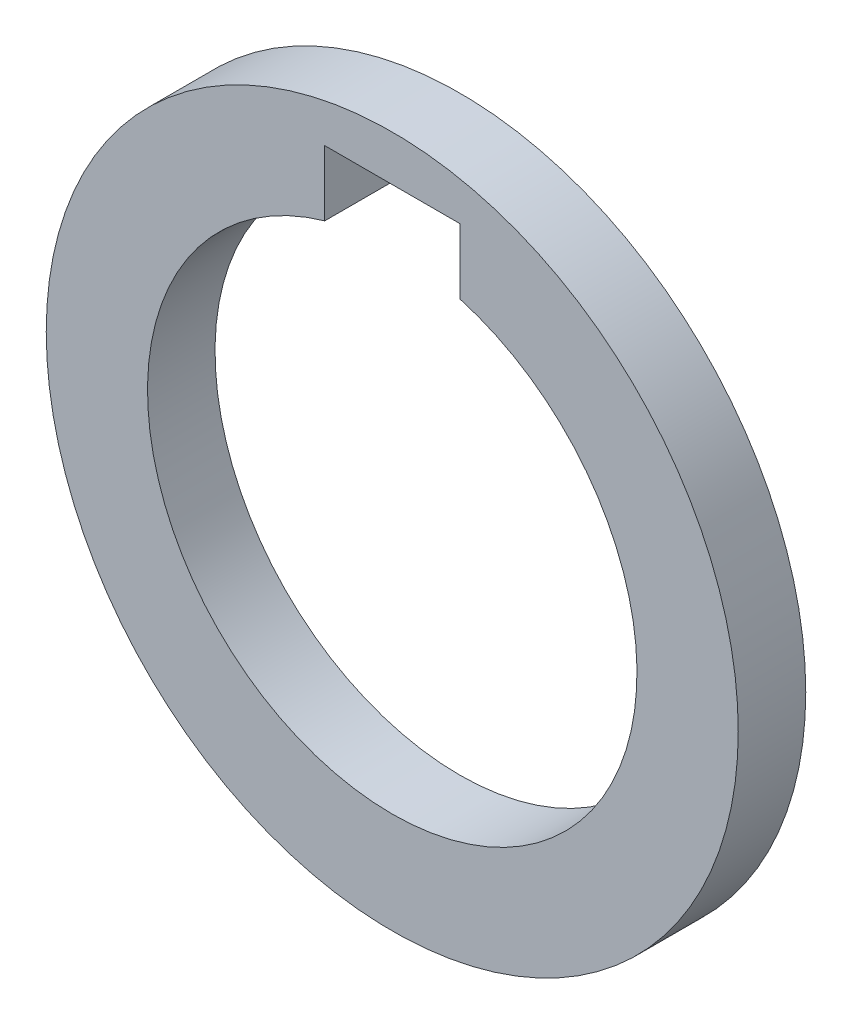
ISO-10303-21;
HEADER;
FILE_DESCRIPTION(('STEP AP214'),'2;1');
FILE_NAME('part.step','',(''),(''),'','','');
FILE_SCHEMA(('AUTOMOTIVE_DESIGN { 1 0 10303 214 1 1 1 1 }'));
ENDSEC;
DATA;
#1=APPLICATION_CONTEXT('core data for automotive mechanical design processes');
#2=APPLICATION_PROTOCOL_DEFINITION('international standard','automotive_design',2000,#1);
#3=PRODUCT_CONTEXT('',#1,'mechanical');
#4=PRODUCT('Part','Part','',(#3));
#5=PRODUCT_RELATED_PRODUCT_CATEGORY('part','',(#4));
#6=PRODUCT_DEFINITION_FORMATION('','',#4);
#7=PRODUCT_DEFINITION_CONTEXT('part definition',#1,'design');
#8=PRODUCT_DEFINITION('design','',#6,#7);
#9=PRODUCT_DEFINITION_SHAPE('','',#8);
#10=(LENGTH_UNIT() NAMED_UNIT(*) SI_UNIT(.MILLI.,.METRE.));
#11=(NAMED_UNIT(*) PLANE_ANGLE_UNIT() SI_UNIT($,.RADIAN.));
#12=(NAMED_UNIT(*) SI_UNIT($,.STERADIAN.) SOLID_ANGLE_UNIT());
#13=UNCERTAINTY_MEASURE_WITH_UNIT(LENGTH_MEASURE(1.E-05),#10,'distance_accuracy_value','');
#14=(GEOMETRIC_REPRESENTATION_CONTEXT(3) GLOBAL_UNCERTAINTY_ASSIGNED_CONTEXT((#13)) GLOBAL_UNIT_ASSIGNED_CONTEXT((#10,
#11,#12)) REPRESENTATION_CONTEXT('',''));
#15=CARTESIAN_POINT('',(0.,0.,0.));
#16=DIRECTION('',(0.,0.,1.));
#17=DIRECTION('',(1.,0.,0.));
#18=AXIS2_PLACEMENT_3D('',#15,#16,#17);
#19=CARTESIAN_POINT('',(0.,0.,4.));
#20=DIRECTION('',(0.,0.,1.));
#21=DIRECTION('',(1.,0.,0.));
#22=AXIS2_PLACEMENT_3D('',#19,#20,#21);
#23=PLANE('',#22);
#24=CARTESIAN_POINT('',(0.,0.,4.));
#25=DIRECTION('',(0.,0.,1.));
#26=DIRECTION('',(1.,0.,0.));
#27=AXIS2_PLACEMENT_3D('',#24,#25,#26);
#28=CIRCLE('',#27,20.5);
#29=CARTESIAN_POINT('',(20.5,0.,4.));
#30=VERTEX_POINT('',#29);
#31=EDGE_CURVE('E11',#30,#30,#28,.T.);
#32=ORIENTED_EDGE('',*,*,#31,.T.);
#33=EDGE_LOOP('',(#32));
#34=FACE_BOUND('',#33,.T.);
#35=DIRECTION('',(0.,1.,0.));
#36=VECTOR('',#35,1.);
#37=CARTESIAN_POINT('',(4.,17.8,4.));
#38=LINE('',#37,#36);
#39=CARTESIAN_POINT('',(4.,13.9373598647664,4.));
#40=VERTEX_POINT('',#39);
#41=CARTESIAN_POINT('',(4.,17.8,4.));
#42=VERTEX_POINT('',#41);
#43=EDGE_CURVE('E94',#40,#42,#38,.T.);
#44=ORIENTED_EDGE('',*,*,#43,.F.);
#45=CARTESIAN_POINT('',(0.,0.,4.));
#46=DIRECTION('',(0.,0.,1.));
#47=DIRECTION('',(1.,0.,0.));
#48=AXIS2_PLACEMENT_3D('',#45,#46,#47);
#49=CIRCLE('',#48,14.5);
#50=CARTESIAN_POINT('',(-4.,13.9373598647664,4.));
#51=VERTEX_POINT('',#50);
#52=EDGE_CURVE('E85',#51,#40,#49,.T.);
#53=ORIENTED_EDGE('',*,*,#52,.F.);
#54=DIRECTION('',(0.,-1.,0.));
#55=VECTOR('',#54,1.);
#56=CARTESIAN_POINT('',(-4.,13.9373598647664,4.));
#57=LINE('',#56,#55);
#58=CARTESIAN_POINT('',(-4.,17.8,4.));
#59=VERTEX_POINT('',#58);
#60=EDGE_CURVE('E110',#59,#51,#57,.T.);
#61=ORIENTED_EDGE('',*,*,#60,.F.);
#62=DIRECTION('',(-1.,0.,0.));
#63=VECTOR('',#62,1.);
#64=CARTESIAN_POINT('',(-4.,17.8,4.));
#65=LINE('',#64,#63);
#66=EDGE_CURVE('E106',#42,#59,#65,.T.);
#67=ORIENTED_EDGE('',*,*,#66,.F.);
#68=EDGE_LOOP('',(#44,#53,#61,#67));
#69=FACE_BOUND('',#68,.T.);
#70=ADVANCED_FACE('F43',(#34,#69),#23,.T.);
#71=CARTESIAN_POINT('',(0.,0.,0.));
#72=DIRECTION('',(0.,0.,1.));
#73=DIRECTION('',(1.,0.,0.));
#74=AXIS2_PLACEMENT_3D('',#71,#72,#73);
#75=PLANE('',#74);
#76=CARTESIAN_POINT('',(0.,0.,0.));
#77=DIRECTION('',(0.,0.,1.));
#78=DIRECTION('',(1.,0.,0.));
#79=AXIS2_PLACEMENT_3D('',#76,#77,#78);
#80=CIRCLE('',#79,20.5);
#81=CARTESIAN_POINT('',(20.5,0.,0.));
#82=VERTEX_POINT('',#81);
#83=EDGE_CURVE('E47',#82,#82,#80,.T.);
#84=ORIENTED_EDGE('',*,*,#83,.F.);
#85=EDGE_LOOP('',(#84));
#86=FACE_BOUND('',#85,.T.);
#87=CARTESIAN_POINT('',(0.,0.,0.));
#88=DIRECTION('',(0.,0.,1.));
#89=DIRECTION('',(1.,0.,0.));
#90=AXIS2_PLACEMENT_3D('',#87,#88,#89);
#91=CIRCLE('',#90,14.5);
#92=CARTESIAN_POINT('',(-4.,13.9373598647664,0.));
#93=VERTEX_POINT('',#92);
#94=CARTESIAN_POINT('',(4.,13.9373598647664,0.));
#95=VERTEX_POINT('',#94);
#96=EDGE_CURVE('E67',#93,#95,#91,.T.);
#97=ORIENTED_EDGE('',*,*,#96,.T.);
#98=DIRECTION('',(0.,1.,0.));
#99=VECTOR('',#98,1.);
#100=CARTESIAN_POINT('',(4.,17.8,0.));
#101=LINE('',#100,#99);
#102=CARTESIAN_POINT('',(4.,17.8,0.));
#103=VERTEX_POINT('',#102);
#104=EDGE_CURVE('E101',#95,#103,#101,.T.);
#105=ORIENTED_EDGE('',*,*,#104,.T.);
#106=DIRECTION('',(-1.,0.,0.));
#107=VECTOR('',#106,1.);
#108=CARTESIAN_POINT('',(-4.,17.8,0.));
#109=LINE('',#108,#107);
#110=CARTESIAN_POINT('',(-4.,17.8,0.));
#111=VERTEX_POINT('',#110);
#112=EDGE_CURVE('E119',#103,#111,#109,.T.);
#113=ORIENTED_EDGE('',*,*,#112,.T.);
#114=DIRECTION('',(0.,-1.,0.));
#115=VECTOR('',#114,1.);
#116=CARTESIAN_POINT('',(-4.,13.9373598647664,0.));
#117=LINE('',#116,#115);
#118=EDGE_CURVE('E95',#111,#93,#117,.T.);
#119=ORIENTED_EDGE('',*,*,#118,.T.);
#120=EDGE_LOOP('',(#97,#105,#113,#119));
#121=FACE_BOUND('',#120,.T.);
#122=ADVANCED_FACE('F135',(#86,#121),#75,.F.);
#123=CARTESIAN_POINT('',(0.,0.,4.));
#124=DIRECTION('',(0.,0.,-1.));
#125=DIRECTION('',(-1.,0.,0.));
#126=AXIS2_PLACEMENT_3D('',#123,#124,#125);
#127=CYLINDRICAL_SURFACE('',#126,20.5);
#128=ORIENTED_EDGE('',*,*,#31,.F.);
#129=EDGE_LOOP('',(#128));
#130=FACE_BOUND('',#129,.T.);
#131=ORIENTED_EDGE('',*,*,#83,.T.);
#132=EDGE_LOOP('',(#131));
#133=FACE_BOUND('',#132,.T.);
#134=ADVANCED_FACE('F45',(#130,#133),#127,.T.);
#135=CARTESIAN_POINT('',(0.,0.,4.));
#136=DIRECTION('',(0.,0.,-1.));
#137=DIRECTION('',(-1.,0.,0.));
#138=AXIS2_PLACEMENT_3D('',#135,#136,#137);
#139=CYLINDRICAL_SURFACE('',#138,14.5);
#140=ORIENTED_EDGE('',*,*,#96,.F.);
#141=DIRECTION('',(0.,0.,-1.));
#142=VECTOR('',#141,1.);
#143=CARTESIAN_POINT('',(-4.,13.9373598647664,4.));
#144=LINE('',#143,#142);
#145=EDGE_CURVE('E89',#51,#93,#144,.T.);
#146=ORIENTED_EDGE('',*,*,#145,.F.);
#147=ORIENTED_EDGE('',*,*,#52,.T.);
#148=DIRECTION('',(0.,0.,-1.));
#149=VECTOR('',#148,1.);
#150=CARTESIAN_POINT('',(4.,13.9373598647664,4.));
#151=LINE('',#150,#149);
#152=EDGE_CURVE('E88',#40,#95,#151,.T.);
#153=ORIENTED_EDGE('',*,*,#152,.T.);
#154=EDGE_LOOP('',(#140,#146,#147,#153));
#155=FACE_BOUND('',#154,.T.);
#156=ADVANCED_FACE('F87',(#155),#139,.F.);
#157=CARTESIAN_POINT('',(4.,17.8,4.));
#158=DIRECTION('',(-1.,0.,0.));
#159=DIRECTION('',(0.,0.,1.));
#160=AXIS2_PLACEMENT_3D('',#157,#158,#159);
#161=PLANE('',#160);
#162=ORIENTED_EDGE('',*,*,#104,.F.);
#163=ORIENTED_EDGE('',*,*,#152,.F.);
#164=ORIENTED_EDGE('',*,*,#43,.T.);
#165=DIRECTION('',(0.,0.,-1.));
#166=VECTOR('',#165,1.);
#167=CARTESIAN_POINT('',(4.,17.8,4.));
#168=LINE('',#167,#166);
#169=EDGE_CURVE('E103',#42,#103,#168,.T.);
#170=ORIENTED_EDGE('',*,*,#169,.T.);
#171=EDGE_LOOP('',(#162,#163,#164,#170));
#172=FACE_BOUND('',#171,.T.);
#173=ADVANCED_FACE('F98',(#172),#161,.T.);
#174=CARTESIAN_POINT('',(-4.,17.8,4.));
#175=DIRECTION('',(0.,-1.,0.));
#176=DIRECTION('',(0.,0.,-1.));
#177=AXIS2_PLACEMENT_3D('',#174,#175,#176);
#178=PLANE('',#177);
#179=ORIENTED_EDGE('',*,*,#112,.F.);
#180=ORIENTED_EDGE('',*,*,#169,.F.);
#181=ORIENTED_EDGE('',*,*,#66,.T.);
#182=DIRECTION('',(0.,0.,-1.));
#183=VECTOR('',#182,1.);
#184=CARTESIAN_POINT('',(-4.,17.8,4.));
#185=LINE('',#184,#183);
#186=EDGE_CURVE('E59',#59,#111,#185,.T.);
#187=ORIENTED_EDGE('',*,*,#186,.T.);
#188=EDGE_LOOP('',(#179,#180,#181,#187));
#189=FACE_BOUND('',#188,.T.);
#190=ADVANCED_FACE('F133',(#189),#178,.T.);
#191=CARTESIAN_POINT('',(-4.,13.9373598647664,4.));
#192=DIRECTION('',(1.,0.,0.));
#193=DIRECTION('',(0.,0.,-1.));
#194=AXIS2_PLACEMENT_3D('',#191,#192,#193);
#195=PLANE('',#194);
#196=ORIENTED_EDGE('',*,*,#118,.F.);
#197=ORIENTED_EDGE('',*,*,#186,.F.);
#198=ORIENTED_EDGE('',*,*,#60,.T.);
#199=ORIENTED_EDGE('',*,*,#145,.T.);
#200=EDGE_LOOP('',(#196,#197,#198,#199));
#201=FACE_BOUND('',#200,.T.);
#202=ADVANCED_FACE('F136',(#201),#195,.T.);
#203=CLOSED_SHELL('',(#70,#122,#134,#156,#173,#190,#202));
#204=MANIFOLD_SOLID_BREP('B2',#203);
#205=ADVANCED_BREP_SHAPE_REPRESENTATION('',(#18,#204),#14);
#206=SHAPE_DEFINITION_REPRESENTATION(#9,#205);
ENDSEC;
END-ISO-10303-21;
